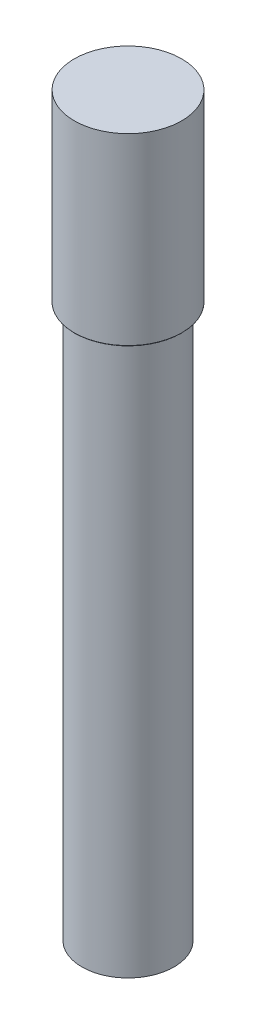
ISO-10303-21;
HEADER;
FILE_DESCRIPTION(('STEP AP214'),'2;1');
FILE_NAME('part.step','',(''),(''),'','','');
FILE_SCHEMA(('AUTOMOTIVE_DESIGN { 1 0 10303 214 1 1 1 1 }'));
ENDSEC;
DATA;
#1=APPLICATION_CONTEXT('core data for automotive mechanical design processes');
#2=APPLICATION_PROTOCOL_DEFINITION('international standard','automotive_design',2000,#1);
#3=PRODUCT_CONTEXT('',#1,'mechanical');
#4=PRODUCT('Part','Part','',(#3));
#5=PRODUCT_RELATED_PRODUCT_CATEGORY('part','',(#4));
#6=PRODUCT_DEFINITION_FORMATION('','',#4);
#7=PRODUCT_DEFINITION_CONTEXT('part definition',#1,'design');
#8=PRODUCT_DEFINITION('design','',#6,#7);
#9=PRODUCT_DEFINITION_SHAPE('','',#8);
#10=(LENGTH_UNIT() NAMED_UNIT(*) SI_UNIT(.MILLI.,.METRE.));
#11=(NAMED_UNIT(*) PLANE_ANGLE_UNIT() SI_UNIT($,.RADIAN.));
#12=(NAMED_UNIT(*) SI_UNIT($,.STERADIAN.) SOLID_ANGLE_UNIT());
#13=UNCERTAINTY_MEASURE_WITH_UNIT(LENGTH_MEASURE(1.E-05),#10,'distance_accuracy_value','');
#14=(GEOMETRIC_REPRESENTATION_CONTEXT(3) GLOBAL_UNCERTAINTY_ASSIGNED_CONTEXT((#13)) GLOBAL_UNIT_ASSIGNED_CONTEXT((#10,
#11,#12)) REPRESENTATION_CONTEXT('',''));
#15=CARTESIAN_POINT('',(0.,0.,0.));
#16=DIRECTION('',(0.,0.,1.));
#17=DIRECTION('',(1.,0.,0.));
#18=AXIS2_PLACEMENT_3D('',#15,#16,#17);
#19=CARTESIAN_POINT('',(0.,228.6,0.));
#20=DIRECTION('',(0.,-1.,0.));
#21=DIRECTION('',(0.,0.,-1.));
#22=AXIS2_PLACEMENT_3D('',#19,#20,#21);
#23=CYLINDRICAL_SURFACE('',#22,19.05);
#24=CARTESIAN_POINT('',(0.,228.346,0.));
#25=DIRECTION('',(0.,1.,0.));
#26=DIRECTION('',(0.,0.,1.));
#27=AXIS2_PLACEMENT_3D('',#24,#25,#26);
#28=CIRCLE('',#27,19.05);
#29=CARTESIAN_POINT('',(0.,228.346,19.05));
#30=VERTEX_POINT('',#29);
#31=EDGE_CURVE('E53',#30,#30,#28,.F.);
#32=ORIENTED_EDGE('',*,*,#31,.T.);
#33=EDGE_LOOP('',(#32));
#34=FACE_BOUND('',#33,.T.);
#35=CARTESIAN_POINT('',(0.,0.,0.));
#36=DIRECTION('',(0.,1.,0.));
#37=DIRECTION('',(0.,0.,1.));
#38=AXIS2_PLACEMENT_3D('',#35,#36,#37);
#39=CIRCLE('',#38,19.05);
#40=CARTESIAN_POINT('',(0.,0.,19.05));
#41=VERTEX_POINT('',#40);
#42=EDGE_CURVE('E66',#41,#41,#39,.T.);
#43=ORIENTED_EDGE('',*,*,#42,.T.);
#44=EDGE_LOOP('',(#43));
#45=FACE_BOUND('',#44,.T.);
#46=ADVANCED_FACE('F46',(#34,#45),#23,.T.);
#47=CARTESIAN_POINT('',(0.,0.,0.));
#48=DIRECTION('',(0.,1.,0.));
#49=DIRECTION('',(0.,0.,1.));
#50=AXIS2_PLACEMENT_3D('',#47,#48,#49);
#51=PLANE('',#50);
#52=ORIENTED_EDGE('',*,*,#42,.F.);
#53=EDGE_LOOP('',(#52));
#54=FACE_BOUND('',#53,.T.);
#55=ADVANCED_FACE('F77',(#54),#51,.F.);
#56=CARTESIAN_POINT('',(0.,304.8,0.));
#57=DIRECTION('',(0.,-1.,0.));
#58=DIRECTION('',(0.,0.,-1.));
#59=AXIS2_PLACEMENT_3D('',#56,#57,#58);
#60=CYLINDRICAL_SURFACE('',#59,22.225);
#61=CARTESIAN_POINT('',(0.,228.854,0.));
#62=DIRECTION('',(0.,1.,0.));
#63=DIRECTION('',(0.,0.,1.));
#64=AXIS2_PLACEMENT_3D('',#61,#62,#63);
#65=CIRCLE('',#64,22.225);
#66=CARTESIAN_POINT('',(0.,228.854,-22.225));
#67=VERTEX_POINT('',#66);
#68=EDGE_CURVE('E12',#67,#67,#65,.T.);
#69=CARTESIAN_POINT('',(0.,304.8,0.));
#70=DIRECTION('',(0.,1.,0.));
#71=DIRECTION('',(0.,0.,1.));
#72=AXIS2_PLACEMENT_3D('',#69,#70,#71);
#73=CIRCLE('',#72,22.225);
#74=CARTESIAN_POINT('',(0.,304.8,-22.225));
#75=VERTEX_POINT('',#74);
#76=EDGE_CURVE('E69',#75,#75,#73,.T.);
#77=CARTESIAN_POINT('',(0.,228.854,-22.225));
#78=CARTESIAN_POINT('',(0.,229.645104166667,-22.225));
#79=CARTESIAN_POINT('',(0.,230.436208333333,-22.225));
#80=CARTESIAN_POINT('',(0.,232.018416666667,-22.225));
#81=CARTESIAN_POINT('',(0.,232.809520833333,-22.225));
#82=CARTESIAN_POINT('',(0.,234.391729166667,-22.225));
#83=CARTESIAN_POINT('',(0.,235.182833333333,-22.225));
#84=CARTESIAN_POINT('',(0.,236.765041666667,-22.225));
#85=CARTESIAN_POINT('',(0.,237.556145833333,-22.225));
#86=CARTESIAN_POINT('',(0.,239.138354166667,-22.225));
#87=CARTESIAN_POINT('',(0.,239.929458333333,-22.225));
#88=CARTESIAN_POINT('',(0.,241.511666666667,-22.225));
#89=CARTESIAN_POINT('',(0.,242.302770833333,-22.225));
#90=CARTESIAN_POINT('',(0.,243.884979166667,-22.225));
#91=CARTESIAN_POINT('',(0.,244.676083333333,-22.225));
#92=CARTESIAN_POINT('',(0.,246.258291666667,-22.225));
#93=CARTESIAN_POINT('',(0.,247.049395833333,-22.225));
#94=CARTESIAN_POINT('',(0.,248.631604166667,-22.225));
#95=CARTESIAN_POINT('',(0.,249.422708333333,-22.225));
#96=CARTESIAN_POINT('',(0.,251.004916666667,-22.225));
#97=CARTESIAN_POINT('',(0.,251.796020833333,-22.225));
#98=CARTESIAN_POINT('',(0.,253.378229166667,-22.225));
#99=CARTESIAN_POINT('',(0.,254.169333333333,-22.225));
#100=CARTESIAN_POINT('',(0.,255.751541666667,-22.225));
#101=CARTESIAN_POINT('',(0.,256.542645833333,-22.225));
#102=CARTESIAN_POINT('',(0.,258.124854166667,-22.225));
#103=CARTESIAN_POINT('',(0.,258.915958333333,-22.225));
#104=CARTESIAN_POINT('',(0.,260.498166666667,-22.225));
#105=CARTESIAN_POINT('',(0.,261.289270833333,-22.225));
#106=CARTESIAN_POINT('',(0.,262.871479166667,-22.225));
#107=CARTESIAN_POINT('',(0.,263.662583333333,-22.225));
#108=CARTESIAN_POINT('',(0.,265.244791666667,-22.225));
#109=CARTESIAN_POINT('',(0.,266.035895833333,-22.225));
#110=CARTESIAN_POINT('',(0.,267.618104166667,-22.225));
#111=CARTESIAN_POINT('',(0.,268.409208333333,-22.225));
#112=CARTESIAN_POINT('',(0.,269.991416666667,-22.225));
#113=CARTESIAN_POINT('',(0.,270.782520833333,-22.225));
#114=CARTESIAN_POINT('',(0.,272.364729166667,-22.225));
#115=CARTESIAN_POINT('',(0.,273.155833333333,-22.225));
#116=CARTESIAN_POINT('',(0.,274.738041666667,-22.225));
#117=CARTESIAN_POINT('',(0.,275.529145833333,-22.225));
#118=CARTESIAN_POINT('',(0.,277.111354166667,-22.225));
#119=CARTESIAN_POINT('',(0.,277.902458333333,-22.225));
#120=CARTESIAN_POINT('',(0.,279.484666666667,-22.225));
#121=CARTESIAN_POINT('',(0.,280.275770833333,-22.225));
#122=CARTESIAN_POINT('',(0.,281.857979166667,-22.225));
#123=CARTESIAN_POINT('',(0.,282.649083333333,-22.225));
#124=CARTESIAN_POINT('',(0.,284.231291666667,-22.225));
#125=CARTESIAN_POINT('',(0.,285.022395833333,-22.225));
#126=CARTESIAN_POINT('',(0.,286.604604166667,-22.225));
#127=CARTESIAN_POINT('',(0.,287.395708333333,-22.225));
#128=CARTESIAN_POINT('',(0.,288.977916666667,-22.225));
#129=CARTESIAN_POINT('',(0.,289.769020833333,-22.225));
#130=CARTESIAN_POINT('',(0.,291.351229166667,-22.225));
#131=CARTESIAN_POINT('',(0.,292.142333333333,-22.225));
#132=CARTESIAN_POINT('',(0.,293.724541666667,-22.225));
#133=CARTESIAN_POINT('',(0.,294.515645833333,-22.225));
#134=CARTESIAN_POINT('',(0.,296.097854166667,-22.225));
#135=CARTESIAN_POINT('',(0.,296.888958333333,-22.225));
#136=CARTESIAN_POINT('',(0.,298.471166666667,-22.225));
#137=CARTESIAN_POINT('',(0.,299.262270833333,-22.225));
#138=CARTESIAN_POINT('',(0.,300.844479166667,-22.225));
#139=CARTESIAN_POINT('',(0.,301.635583333333,-22.225));
#140=CARTESIAN_POINT('',(0.,303.217791666667,-22.225));
#141=CARTESIAN_POINT('',(0.,304.008895833333,-22.225));
#142=CARTESIAN_POINT('',(0.,304.8,-22.225));
#143=B_SPLINE_CURVE_WITH_KNOTS('',3,(#77,#78,#79,#80,#81,#82,#83,#84,#85,#86,#87,#88,#89,#90,
#91,#92,#93,#94,#95,#96,#97,#98,#99,#100,#101,#102,#103,#104,#105,#106,#107,#108,#109,#110,#111,
#112,#113,#114,#115,#116,#117,#118,#119,#120,#121,#122,#123,#124,#125,#126,#127,#128,#129,#130,
#131,#132,#133,#134,#135,#136,#137,#138,#139,#140,#141,#142),.UNSPECIFIED.,.F.,.F.,(4,2,2,2,2,2,
2,2,2,2,2,2,2,2,2,2,2,2,2,2,2,2,2,2,2,2,2,2,2,2,2,2,4),(0.,2.3733125,4.746625,7.11993750000001,
9.49325000000001,11.8665625,14.239875,16.6131875,18.9865,21.3598125,23.733125,26.1064375,
28.47975,30.8530625,33.226375,35.5996875,37.973,40.3463125,42.719625,45.0929375,47.46625,
49.8395625,52.212875,54.5861875,56.9595,59.3328125,61.706125,64.0794375,66.45275,68.8260625,
71.199375,73.5726875,75.946),.UNSPECIFIED.);
#144=EDGE_CURVE('BSEAM75',#67,#75,#143,.T.);
#145=ORIENTED_EDGE('',*,*,#68,.T.);
#146=ORIENTED_EDGE('',*,*,#76,.F.);
#147=ORIENTED_EDGE('',*,*,#144,.T.);
#148=ORIENTED_EDGE('',*,*,#144,.F.);
#149=EDGE_LOOP('',(#145,#147,#146,#148));
#150=FACE_BOUND('',#149,.T.);
#151=ADVANCED_FACE('F75',(#150),#60,.T.);
#152=CARTESIAN_POINT('',(0.,304.8,0.));
#153=DIRECTION('',(0.,1.,0.));
#154=DIRECTION('',(0.,0.,1.));
#155=AXIS2_PLACEMENT_3D('',#152,#153,#154);
#156=PLANE('',#155);
#157=ORIENTED_EDGE('',*,*,#76,.T.);
#158=EDGE_LOOP('',(#157));
#159=FACE_BOUND('',#158,.T.);
#160=ADVANCED_FACE('F73',(#159),#156,.T.);
#161=CARTESIAN_POINT('',(0.,228.6,0.));
#162=DIRECTION('',(0.,1.,0.));
#163=DIRECTION('',(0.,0.,1.));
#164=AXIS2_PLACEMENT_3D('',#161,#162,#163);
#165=PLANE('',#164);
#166=CARTESIAN_POINT('',(0.,228.6,0.));
#167=DIRECTION('',(0.,1.,0.));
#168=DIRECTION('',(0.,0.,1.));
#169=AXIS2_PLACEMENT_3D('',#166,#167,#168);
#170=CIRCLE('',#169,19.304);
#171=CARTESIAN_POINT('',(0.,228.6,19.304));
#172=VERTEX_POINT('',#171);
#173=EDGE_CURVE('E57',#172,#172,#170,.T.);
#174=ORIENTED_EDGE('',*,*,#173,.T.);
#175=EDGE_LOOP('',(#174));
#176=FACE_BOUND('',#175,.T.);
#177=CARTESIAN_POINT('',(0.,228.6,0.));
#178=DIRECTION('',(0.,1.,0.));
#179=DIRECTION('',(0.,0.,1.));
#180=AXIS2_PLACEMENT_3D('',#177,#178,#179);
#181=CIRCLE('',#180,21.971);
#182=CARTESIAN_POINT('',(0.,228.6,21.971));
#183=VERTEX_POINT('',#182);
#184=EDGE_CURVE('E61',#183,#183,#181,.F.);
#185=ORIENTED_EDGE('',*,*,#184,.T.);
#186=EDGE_LOOP('',(#185));
#187=FACE_BOUND('',#186,.T.);
#188=ADVANCED_FACE('F83',(#176,#187),#165,.F.);
#189=CARTESIAN_POINT('',(0.,228.346,0.));
#190=DIRECTION('',(0.,1.,0.));
#191=DIRECTION('',(0.,0.,1.));
#192=AXIS2_PLACEMENT_3D('',#189,#190,#191);
#193=TOROIDAL_SURFACE('',#192,19.304,0.254);
#194=ORIENTED_EDGE('',*,*,#31,.F.);
#195=EDGE_LOOP('',(#194));
#196=FACE_BOUND('',#195,.T.);
#197=ORIENTED_EDGE('',*,*,#173,.F.);
#198=EDGE_LOOP('',(#197));
#199=FACE_BOUND('',#198,.T.);
#200=ADVANCED_FACE('F93',(#196,#199),#193,.F.);
#201=CARTESIAN_POINT('',(0.,228.854,0.));
#202=DIRECTION('',(0.,1.,0.));
#203=DIRECTION('',(0.,0.,1.));
#204=AXIS2_PLACEMENT_3D('',#201,#202,#203);
#205=TOROIDAL_SURFACE('',#204,21.971,0.254);
#206=ORIENTED_EDGE('',*,*,#184,.F.);
#207=EDGE_LOOP('',(#206));
#208=FACE_BOUND('',#207,.T.);
#209=ORIENTED_EDGE('',*,*,#68,.F.);
#210=EDGE_LOOP('',(#209));
#211=FACE_BOUND('',#210,.T.);
#212=ADVANCED_FACE('F48',(#208,#211),#205,.T.);
#213=CLOSED_SHELL('',(#46,#55,#151,#160,#188,#200,#212));
#214=MANIFOLD_SOLID_BREP('B2',#213);
#215=ADVANCED_BREP_SHAPE_REPRESENTATION('',(#18,#214),#14);
#216=SHAPE_DEFINITION_REPRESENTATION(#9,#215);
ENDSEC;
END-ISO-10303-21;
